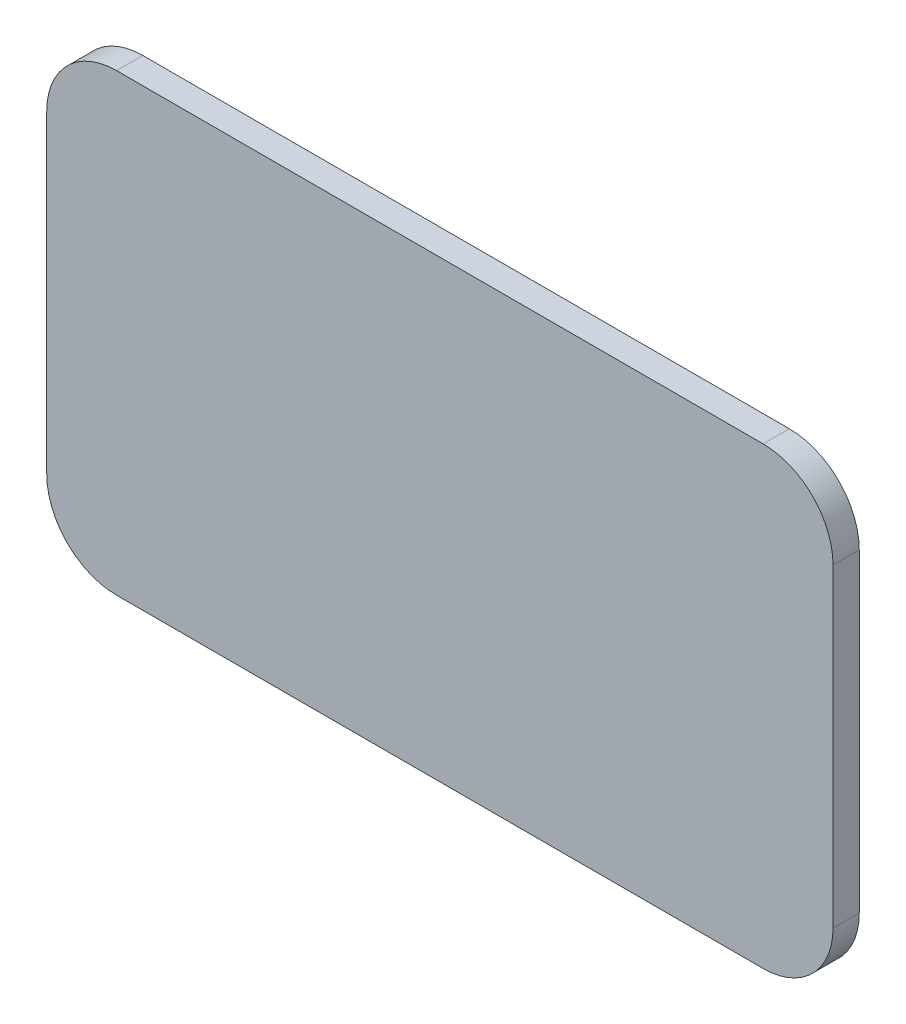
ISO-10303-21;
HEADER;
FILE_DESCRIPTION(('STEP AP214'),'2;1');
FILE_NAME('part.step','',(''),(''),'','','');
FILE_SCHEMA(('AUTOMOTIVE_DESIGN { 1 0 10303 214 1 1 1 1 }'));
ENDSEC;
DATA;
#1=APPLICATION_CONTEXT('core data for automotive mechanical design processes');
#2=APPLICATION_PROTOCOL_DEFINITION('international standard','automotive_design',2000,#1);
#3=PRODUCT_CONTEXT('',#1,'mechanical');
#4=PRODUCT('Part','Part','',(#3));
#5=PRODUCT_RELATED_PRODUCT_CATEGORY('part','',(#4));
#6=PRODUCT_DEFINITION_FORMATION('','',#4);
#7=PRODUCT_DEFINITION_CONTEXT('part definition',#1,'design');
#8=PRODUCT_DEFINITION('design','',#6,#7);
#9=PRODUCT_DEFINITION_SHAPE('','',#8);
#10=(LENGTH_UNIT() NAMED_UNIT(*) SI_UNIT(.MILLI.,.METRE.));
#11=(NAMED_UNIT(*) PLANE_ANGLE_UNIT() SI_UNIT($,.RADIAN.));
#12=(NAMED_UNIT(*) SI_UNIT($,.STERADIAN.) SOLID_ANGLE_UNIT());
#13=UNCERTAINTY_MEASURE_WITH_UNIT(LENGTH_MEASURE(1.E-05),#10,'distance_accuracy_value','');
#14=(GEOMETRIC_REPRESENTATION_CONTEXT(3) GLOBAL_UNCERTAINTY_ASSIGNED_CONTEXT((#13)) GLOBAL_UNIT_ASSIGNED_CONTEXT((#10,
#11,#12)) REPRESENTATION_CONTEXT('',''));
#15=CARTESIAN_POINT('',(0.,0.,0.));
#16=DIRECTION('',(0.,0.,1.));
#17=DIRECTION('',(1.,0.,0.));
#18=AXIS2_PLACEMENT_3D('',#15,#16,#17);
#19=CARTESIAN_POINT('',(0.,0.,1.5));
#20=DIRECTION('',(1.,0.,0.));
#21=DIRECTION('',(0.,1.,0.));
#22=AXIS2_PLACEMENT_3D('',#19,#20,#21);
#23=PLANE('',#22);
#24=DIRECTION('',(0.,-1.,0.));
#25=VECTOR('',#24,1.);
#26=CARTESIAN_POINT('',(0.,0.,0.));
#27=LINE('',#26,#25);
#28=CARTESIAN_POINT('',(0.,-4.,0.));
#29=VERTEX_POINT('',#28);
#30=CARTESIAN_POINT('',(0.,-22.,0.));
#31=VERTEX_POINT('',#30);
#32=EDGE_CURVE('E128',#29,#31,#27,.T.);
#33=ORIENTED_EDGE('',*,*,#32,.T.);
#34=DIRECTION('',(0.,0.,-1.));
#35=VECTOR('',#34,1.);
#36=CARTESIAN_POINT('',(0.,-22.,1.5));
#37=LINE('',#36,#35);
#38=CARTESIAN_POINT('',(0.,-22.,1.5));
#39=VERTEX_POINT('',#38);
#40=EDGE_CURVE('E106',#31,#39,#37,.F.);
#41=ORIENTED_EDGE('',*,*,#40,.T.);
#42=DIRECTION('',(0.,-1.,0.));
#43=VECTOR('',#42,1.);
#44=CARTESIAN_POINT('',(0.,0.,1.5));
#45=LINE('',#44,#43);
#46=CARTESIAN_POINT('',(0.,-4.,1.5));
#47=VERTEX_POINT('',#46);
#48=EDGE_CURVE('E137',#47,#39,#45,.T.);
#49=ORIENTED_EDGE('',*,*,#48,.F.);
#50=DIRECTION('',(0.,0.,-1.));
#51=VECTOR('',#50,1.);
#52=CARTESIAN_POINT('',(0.,-4.,1.5));
#53=LINE('',#52,#51);
#54=EDGE_CURVE('E111',#47,#29,#53,.T.);
#55=ORIENTED_EDGE('',*,*,#54,.T.);
#56=EDGE_LOOP('',(#33,#41,#49,#55));
#57=FACE_BOUND('',#56,.T.);
#58=ADVANCED_FACE('F35',(#57),#23,.F.);
#59=CARTESIAN_POINT('',(0.,-26.,1.5));
#60=DIRECTION('',(0.,1.,0.));
#61=DIRECTION('',(0.,0.,1.));
#62=AXIS2_PLACEMENT_3D('',#59,#60,#61);
#63=PLANE('',#62);
#64=DIRECTION('',(1.,0.,0.));
#65=VECTOR('',#64,1.);
#66=CARTESIAN_POINT('',(0.,-26.,1.5));
#67=LINE('',#66,#65);
#68=CARTESIAN_POINT('',(4.,-26.,1.5));
#69=VERTEX_POINT('',#68);
#70=CARTESIAN_POINT('',(41.,-26.,1.5));
#71=VERTEX_POINT('',#70);
#72=EDGE_CURVE('E121',#69,#71,#67,.T.);
#73=ORIENTED_EDGE('',*,*,#72,.F.);
#74=DIRECTION('',(0.,0.,-1.));
#75=VECTOR('',#74,1.);
#76=CARTESIAN_POINT('',(4.,-26.,1.5));
#77=LINE('',#76,#75);
#78=CARTESIAN_POINT('',(4.,-26.,0.));
#79=VERTEX_POINT('',#78);
#80=EDGE_CURVE('E105',#69,#79,#77,.T.);
#81=ORIENTED_EDGE('',*,*,#80,.T.);
#82=DIRECTION('',(1.,0.,0.));
#83=VECTOR('',#82,1.);
#84=CARTESIAN_POINT('',(0.,-26.,0.));
#85=LINE('',#84,#83);
#86=CARTESIAN_POINT('',(41.,-26.,0.));
#87=VERTEX_POINT('',#86);
#88=EDGE_CURVE('E118',#79,#87,#85,.T.);
#89=ORIENTED_EDGE('',*,*,#88,.T.);
#90=DIRECTION('',(0.,0.,-1.));
#91=VECTOR('',#90,1.);
#92=CARTESIAN_POINT('',(41.,-26.,1.5));
#93=LINE('',#92,#91);
#94=EDGE_CURVE('E123',#87,#71,#93,.F.);
#95=ORIENTED_EDGE('',*,*,#94,.T.);
#96=EDGE_LOOP('',(#73,#81,#89,#95));
#97=FACE_BOUND('',#96,.T.);
#98=ADVANCED_FACE('F117',(#97),#63,.F.);
#99=CARTESIAN_POINT('',(45.,0.,1.5));
#100=DIRECTION('',(-1.,0.,0.));
#101=DIRECTION('',(0.,0.,1.));
#102=AXIS2_PLACEMENT_3D('',#99,#100,#101);
#103=PLANE('',#102);
#104=DIRECTION('',(0.,1.,0.));
#105=VECTOR('',#104,1.);
#106=CARTESIAN_POINT('',(45.,0.,0.));
#107=LINE('',#106,#105);
#108=CARTESIAN_POINT('',(45.,-22.,0.));
#109=VERTEX_POINT('',#108);
#110=CARTESIAN_POINT('',(45.,-4.,0.));
#111=VERTEX_POINT('',#110);
#112=EDGE_CURVE('E127',#109,#111,#107,.T.);
#113=ORIENTED_EDGE('',*,*,#112,.T.);
#114=DIRECTION('',(0.,0.,-1.));
#115=VECTOR('',#114,1.);
#116=CARTESIAN_POINT('',(45.,-4.,1.5));
#117=LINE('',#116,#115);
#118=CARTESIAN_POINT('',(45.,-4.,1.5));
#119=VERTEX_POINT('',#118);
#120=EDGE_CURVE('E11',#111,#119,#117,.F.);
#121=ORIENTED_EDGE('',*,*,#120,.T.);
#122=DIRECTION('',(0.,1.,0.));
#123=VECTOR('',#122,1.);
#124=CARTESIAN_POINT('',(45.,0.,1.5));
#125=LINE('',#124,#123);
#126=CARTESIAN_POINT('',(45.,-22.,1.5));
#127=VERTEX_POINT('',#126);
#128=EDGE_CURVE('E163',#127,#119,#125,.T.);
#129=ORIENTED_EDGE('',*,*,#128,.F.);
#130=DIRECTION('',(0.,0.,-1.));
#131=VECTOR('',#130,1.);
#132=CARTESIAN_POINT('',(45.,-22.,1.5));
#133=LINE('',#132,#131);
#134=EDGE_CURVE('E43',#127,#109,#133,.T.);
#135=ORIENTED_EDGE('',*,*,#134,.T.);
#136=EDGE_LOOP('',(#113,#121,#129,#135));
#137=FACE_BOUND('',#136,.T.);
#138=ADVANCED_FACE('F161',(#137),#103,.F.);
#139=CARTESIAN_POINT('',(0.,0.,1.5));
#140=DIRECTION('',(0.,-1.,0.));
#141=DIRECTION('',(0.,0.,-1.));
#142=AXIS2_PLACEMENT_3D('',#139,#140,#141);
#143=PLANE('',#142);
#144=DIRECTION('',(-1.,0.,0.));
#145=VECTOR('',#144,1.);
#146=CARTESIAN_POINT('',(0.,0.,0.));
#147=LINE('',#146,#145);
#148=CARTESIAN_POINT('',(41.,0.,0.));
#149=VERTEX_POINT('',#148);
#150=CARTESIAN_POINT('',(4.,0.,0.));
#151=VERTEX_POINT('',#150);
#152=EDGE_CURVE('E131',#149,#151,#147,.T.);
#153=ORIENTED_EDGE('',*,*,#152,.T.);
#154=DIRECTION('',(0.,0.,-1.));
#155=VECTOR('',#154,1.);
#156=CARTESIAN_POINT('',(4.,0.,1.5));
#157=LINE('',#156,#155);
#158=CARTESIAN_POINT('',(4.,0.,1.5));
#159=VERTEX_POINT('',#158);
#160=EDGE_CURVE('E50',#151,#159,#157,.F.);
#161=ORIENTED_EDGE('',*,*,#160,.T.);
#162=DIRECTION('',(-1.,0.,0.));
#163=VECTOR('',#162,1.);
#164=CARTESIAN_POINT('',(0.,0.,1.5));
#165=LINE('',#164,#163);
#166=CARTESIAN_POINT('',(41.,0.,1.5));
#167=VERTEX_POINT('',#166);
#168=EDGE_CURVE('E138',#167,#159,#165,.T.);
#169=ORIENTED_EDGE('',*,*,#168,.F.);
#170=DIRECTION('',(0.,0.,-1.));
#171=VECTOR('',#170,1.);
#172=CARTESIAN_POINT('',(41.,0.,1.5));
#173=LINE('',#172,#171);
#174=EDGE_CURVE('E154',#167,#149,#173,.T.);
#175=ORIENTED_EDGE('',*,*,#174,.T.);
#176=EDGE_LOOP('',(#153,#161,#169,#175));
#177=FACE_BOUND('',#176,.T.);
#178=ADVANCED_FACE('F170',(#177),#143,.F.);
#179=CARTESIAN_POINT('',(0.,0.,1.5));
#180=DIRECTION('',(0.,0.,1.));
#181=DIRECTION('',(1.,0.,0.));
#182=AXIS2_PLACEMENT_3D('',#179,#180,#181);
#183=PLANE('',#182);
#184=ORIENTED_EDGE('',*,*,#48,.T.);
#185=CARTESIAN_POINT('',(4.,-22.,1.5));
#186=DIRECTION('',(0.,0.,1.));
#187=DIRECTION('',(1.,0.,0.));
#188=AXIS2_PLACEMENT_3D('',#185,#186,#187);
#189=CIRCLE('',#188,4.);
#190=EDGE_CURVE('E152',#39,#69,#189,.T.);
#191=ORIENTED_EDGE('',*,*,#190,.T.);
#192=ORIENTED_EDGE('',*,*,#72,.T.);
#193=CARTESIAN_POINT('',(41.,-22.,1.5));
#194=DIRECTION('',(0.,0.,1.));
#195=DIRECTION('',(1.,0.,0.));
#196=AXIS2_PLACEMENT_3D('',#193,#194,#195);
#197=CIRCLE('',#196,4.);
#198=EDGE_CURVE('E147',#71,#127,#197,.T.);
#199=ORIENTED_EDGE('',*,*,#198,.T.);
#200=ORIENTED_EDGE('',*,*,#128,.T.);
#201=CARTESIAN_POINT('',(41.,-4.,1.5));
#202=DIRECTION('',(0.,0.,1.));
#203=DIRECTION('',(1.,0.,0.));
#204=AXIS2_PLACEMENT_3D('',#201,#202,#203);
#205=CIRCLE('',#204,4.);
#206=EDGE_CURVE('E57',#119,#167,#205,.T.);
#207=ORIENTED_EDGE('',*,*,#206,.T.);
#208=ORIENTED_EDGE('',*,*,#168,.T.);
#209=CARTESIAN_POINT('',(4.,-4.,1.5));
#210=DIRECTION('',(0.,0.,1.));
#211=DIRECTION('',(1.,0.,0.));
#212=AXIS2_PLACEMENT_3D('',#209,#210,#211);
#213=CIRCLE('',#212,4.);
#214=EDGE_CURVE('E150',#159,#47,#213,.T.);
#215=ORIENTED_EDGE('',*,*,#214,.T.);
#216=EDGE_LOOP('',(#184,#191,#192,#199,#200,#207,#208,#215));
#217=FACE_BOUND('',#216,.T.);
#218=ADVANCED_FACE('F177',(#217),#183,.T.);
#219=CARTESIAN_POINT('',(0.,0.,0.));
#220=DIRECTION('',(0.,0.,1.));
#221=DIRECTION('',(1.,0.,0.));
#222=AXIS2_PLACEMENT_3D('',#219,#220,#221);
#223=PLANE('',#222);
#224=ORIENTED_EDGE('',*,*,#88,.F.);
#225=CARTESIAN_POINT('',(4.,-22.,0.));
#226=DIRECTION('',(0.,0.,1.));
#227=DIRECTION('',(1.,0.,0.));
#228=AXIS2_PLACEMENT_3D('',#225,#226,#227);
#229=CIRCLE('',#228,4.);
#230=EDGE_CURVE('E101',#79,#31,#229,.F.);
#231=ORIENTED_EDGE('',*,*,#230,.T.);
#232=ORIENTED_EDGE('',*,*,#32,.F.);
#233=CARTESIAN_POINT('',(4.,-4.,0.));
#234=DIRECTION('',(0.,0.,1.));
#235=DIRECTION('',(1.,0.,0.));
#236=AXIS2_PLACEMENT_3D('',#233,#234,#235);
#237=CIRCLE('',#236,4.);
#238=EDGE_CURVE('E112',#29,#151,#237,.F.);
#239=ORIENTED_EDGE('',*,*,#238,.T.);
#240=ORIENTED_EDGE('',*,*,#152,.F.);
#241=CARTESIAN_POINT('',(41.,-4.,0.));
#242=DIRECTION('',(0.,0.,1.));
#243=DIRECTION('',(1.,0.,0.));
#244=AXIS2_PLACEMENT_3D('',#241,#242,#243);
#245=CIRCLE('',#244,4.);
#246=EDGE_CURVE('E141',#149,#111,#245,.F.);
#247=ORIENTED_EDGE('',*,*,#246,.T.);
#248=ORIENTED_EDGE('',*,*,#112,.F.);
#249=CARTESIAN_POINT('',(41.,-22.,0.));
#250=DIRECTION('',(0.,0.,1.));
#251=DIRECTION('',(1.,0.,0.));
#252=AXIS2_PLACEMENT_3D('',#249,#250,#251);
#253=CIRCLE('',#252,4.);
#254=EDGE_CURVE('E122',#109,#87,#253,.F.);
#255=ORIENTED_EDGE('',*,*,#254,.T.);
#256=EDGE_LOOP('',(#224,#231,#232,#239,#240,#247,#248,#255));
#257=FACE_BOUND('',#256,.T.);
#258=ADVANCED_FACE('F125',(#257),#223,.F.);
#259=CARTESIAN_POINT('',(4.,-22.,1.5));
#260=DIRECTION('',(0.,0.,-1.));
#261=DIRECTION('',(-1.,0.,0.));
#262=AXIS2_PLACEMENT_3D('',#259,#260,#261);
#263=CYLINDRICAL_SURFACE('',#262,4.);
#264=ORIENTED_EDGE('',*,*,#190,.F.);
#265=ORIENTED_EDGE('',*,*,#40,.F.);
#266=ORIENTED_EDGE('',*,*,#230,.F.);
#267=ORIENTED_EDGE('',*,*,#80,.F.);
#268=EDGE_LOOP('',(#264,#265,#266,#267));
#269=FACE_BOUND('',#268,.T.);
#270=ADVANCED_FACE('F104',(#269),#263,.T.);
#271=CARTESIAN_POINT('',(4.,-4.,1.5));
#272=DIRECTION('',(0.,0.,-1.));
#273=DIRECTION('',(-1.,0.,0.));
#274=AXIS2_PLACEMENT_3D('',#271,#272,#273);
#275=CYLINDRICAL_SURFACE('',#274,4.);
#276=ORIENTED_EDGE('',*,*,#214,.F.);
#277=ORIENTED_EDGE('',*,*,#160,.F.);
#278=ORIENTED_EDGE('',*,*,#238,.F.);
#279=ORIENTED_EDGE('',*,*,#54,.F.);
#280=EDGE_LOOP('',(#276,#277,#278,#279));
#281=FACE_BOUND('',#280,.T.);
#282=ADVANCED_FACE('F181',(#281),#275,.T.);
#283=CARTESIAN_POINT('',(41.,-4.,1.5));
#284=DIRECTION('',(0.,0.,-1.));
#285=DIRECTION('',(-1.,0.,0.));
#286=AXIS2_PLACEMENT_3D('',#283,#284,#285);
#287=CYLINDRICAL_SURFACE('',#286,4.);
#288=ORIENTED_EDGE('',*,*,#206,.F.);
#289=ORIENTED_EDGE('',*,*,#120,.F.);
#290=ORIENTED_EDGE('',*,*,#246,.F.);
#291=ORIENTED_EDGE('',*,*,#174,.F.);
#292=EDGE_LOOP('',(#288,#289,#290,#291));
#293=FACE_BOUND('',#292,.T.);
#294=ADVANCED_FACE('F169',(#293),#287,.T.);
#295=CARTESIAN_POINT('',(41.,-22.,1.5));
#296=DIRECTION('',(0.,0.,-1.));
#297=DIRECTION('',(-1.,0.,0.));
#298=AXIS2_PLACEMENT_3D('',#295,#296,#297);
#299=CYLINDRICAL_SURFACE('',#298,4.);
#300=ORIENTED_EDGE('',*,*,#198,.F.);
#301=ORIENTED_EDGE('',*,*,#94,.F.);
#302=ORIENTED_EDGE('',*,*,#254,.F.);
#303=ORIENTED_EDGE('',*,*,#134,.F.);
#304=EDGE_LOOP('',(#300,#301,#302,#303));
#305=FACE_BOUND('',#304,.T.);
#306=ADVANCED_FACE('F37',(#305),#299,.T.);
#307=CLOSED_SHELL('',(#58,#98,#138,#178,#218,#258,#270,#282,#294,#306));
#308=MANIFOLD_SOLID_BREP('B2',#307);
#309=ADVANCED_BREP_SHAPE_REPRESENTATION('',(#18,#308),#14);
#310=SHAPE_DEFINITION_REPRESENTATION(#9,#309);
ENDSEC;
END-ISO-10303-21;
